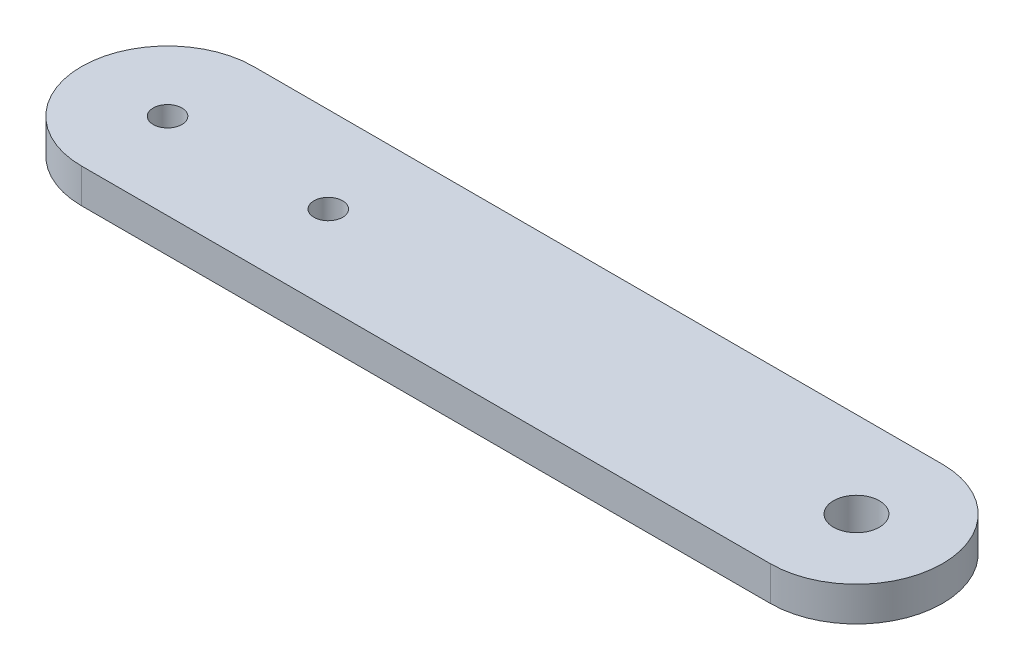
ISO-10303-21;
HEADER;
FILE_DESCRIPTION(('STEP AP214'),'2;1');
FILE_NAME('part.step','',(''),(''),'','','');
FILE_SCHEMA(('AUTOMOTIVE_DESIGN { 1 0 10303 214 1 1 1 1 }'));
ENDSEC;
DATA;
#1=APPLICATION_CONTEXT('core data for automotive mechanical design processes');
#2=APPLICATION_PROTOCOL_DEFINITION('international standard','automotive_design',2000,#1);
#3=PRODUCT_CONTEXT('',#1,'mechanical');
#4=PRODUCT('Part','Part','',(#3));
#5=PRODUCT_RELATED_PRODUCT_CATEGORY('part','',(#4));
#6=PRODUCT_DEFINITION_FORMATION('','',#4);
#7=PRODUCT_DEFINITION_CONTEXT('part definition',#1,'design');
#8=PRODUCT_DEFINITION('design','',#6,#7);
#9=PRODUCT_DEFINITION_SHAPE('','',#8);
#10=(LENGTH_UNIT() NAMED_UNIT(*) SI_UNIT(.MILLI.,.METRE.));
#11=(NAMED_UNIT(*) PLANE_ANGLE_UNIT() SI_UNIT($,.RADIAN.));
#12=(NAMED_UNIT(*) SI_UNIT($,.STERADIAN.) SOLID_ANGLE_UNIT());
#13=UNCERTAINTY_MEASURE_WITH_UNIT(LENGTH_MEASURE(1.E-05),#10,'distance_accuracy_value','');
#14=(GEOMETRIC_REPRESENTATION_CONTEXT(3) GLOBAL_UNCERTAINTY_ASSIGNED_CONTEXT((#13)) GLOBAL_UNIT_ASSIGNED_CONTEXT((#10,
#11,#12)) REPRESENTATION_CONTEXT('',''));
#15=CARTESIAN_POINT('',(0.,0.,0.));
#16=DIRECTION('',(0.,0.,1.));
#17=DIRECTION('',(1.,0.,0.));
#18=AXIS2_PLACEMENT_3D('',#15,#16,#17);
#19=CARTESIAN_POINT('',(0.,3.,0.));
#20=DIRECTION('',(0.,1.,0.));
#21=DIRECTION('',(0.,0.,1.));
#22=AXIS2_PLACEMENT_3D('',#19,#20,#21);
#23=PLANE('',#22);
#24=CARTESIAN_POINT('',(0.,3.,0.));
#25=DIRECTION('',(0.,1.,0.));
#26=DIRECTION('',(0.,0.,1.));
#27=AXIS2_PLACEMENT_3D('',#24,#25,#26);
#28=CIRCLE('',#27,1.25);
#29=CARTESIAN_POINT('',(0.,3.,1.25));
#30=VERTEX_POINT('',#29);
#31=EDGE_CURVE('E115',#30,#30,#28,.T.);
#32=ORIENTED_EDGE('',*,*,#31,.F.);
#33=EDGE_LOOP('',(#32));
#34=FACE_BOUND('',#33,.T.);
#35=CARTESIAN_POINT('',(0.,3.,0.));
#36=DIRECTION('',(0.,1.,0.));
#37=DIRECTION('',(0.,0.,1.));
#38=AXIS2_PLACEMENT_3D('',#35,#36,#37);
#39=CIRCLE('',#38,7.5);
#40=CARTESIAN_POINT('',(0.,3.,-7.5));
#41=VERTEX_POINT('',#40);
#42=CARTESIAN_POINT('',(0.,3.,7.5));
#43=VERTEX_POINT('',#42);
#44=EDGE_CURVE('E85',#41,#43,#39,.T.);
#45=ORIENTED_EDGE('',*,*,#44,.T.);
#46=DIRECTION('',(1.,0.,0.));
#47=VECTOR('',#46,1.);
#48=CARTESIAN_POINT('',(0.,3.,7.5));
#49=LINE('',#48,#47);
#50=CARTESIAN_POINT('',(60.,3.,7.5));
#51=VERTEX_POINT('',#50);
#52=EDGE_CURVE('E80',#43,#51,#49,.T.);
#53=ORIENTED_EDGE('',*,*,#52,.T.);
#54=CARTESIAN_POINT('',(60.,3.,0.));
#55=DIRECTION('',(0.,1.,0.));
#56=DIRECTION('',(0.,0.,1.));
#57=AXIS2_PLACEMENT_3D('',#54,#55,#56);
#58=CIRCLE('',#57,7.5);
#59=CARTESIAN_POINT('',(60.,3.,-7.5));
#60=VERTEX_POINT('',#59);
#61=EDGE_CURVE('E83',#51,#60,#58,.T.);
#62=ORIENTED_EDGE('',*,*,#61,.T.);
#63=DIRECTION('',(-1.,0.,0.));
#64=VECTOR('',#63,1.);
#65=CARTESIAN_POINT('',(0.,3.,-7.5));
#66=LINE('',#65,#64);
#67=EDGE_CURVE('E50',#60,#41,#66,.T.);
#68=ORIENTED_EDGE('',*,*,#67,.T.);
#69=EDGE_LOOP('',(#45,#53,#62,#68));
#70=FACE_BOUND('',#69,.T.);
#71=CARTESIAN_POINT('',(60.,3.,0.));
#72=DIRECTION('',(0.,1.,0.));
#73=DIRECTION('',(0.,0.,1.));
#74=AXIS2_PLACEMENT_3D('',#71,#72,#73);
#75=CIRCLE('',#74,2.);
#76=CARTESIAN_POINT('',(60.,3.,2.));
#77=VERTEX_POINT('',#76);
#78=EDGE_CURVE('E100',#77,#77,#75,.T.);
#79=ORIENTED_EDGE('',*,*,#78,.F.);
#80=EDGE_LOOP('',(#79));
#81=FACE_BOUND('',#80,.T.);
#82=CARTESIAN_POINT('',(14.,3.,0.));
#83=DIRECTION('',(0.,1.,0.));
#84=DIRECTION('',(0.,0.,1.));
#85=AXIS2_PLACEMENT_3D('',#82,#83,#84);
#86=CIRCLE('',#85,1.25);
#87=CARTESIAN_POINT('',(14.,3.,1.25));
#88=VERTEX_POINT('',#87);
#89=EDGE_CURVE('E121',#88,#88,#86,.T.);
#90=ORIENTED_EDGE('',*,*,#89,.F.);
#91=EDGE_LOOP('',(#90));
#92=FACE_BOUND('',#91,.T.);
#93=ADVANCED_FACE('F33',(#34,#70,#81,#92),#23,.T.);
#94=CARTESIAN_POINT('',(0.,0.,0.));
#95=DIRECTION('',(0.,1.,0.));
#96=DIRECTION('',(0.,0.,1.));
#97=AXIS2_PLACEMENT_3D('',#94,#95,#96);
#98=PLANE('',#97);
#99=CARTESIAN_POINT('',(0.,0.,0.));
#100=DIRECTION('',(0.,1.,0.));
#101=DIRECTION('',(0.,0.,1.));
#102=AXIS2_PLACEMENT_3D('',#99,#100,#101);
#103=CIRCLE('',#102,7.5);
#104=CARTESIAN_POINT('',(0.,0.,-7.5));
#105=VERTEX_POINT('',#104);
#106=CARTESIAN_POINT('',(0.,0.,7.5));
#107=VERTEX_POINT('',#106);
#108=EDGE_CURVE('E97',#105,#107,#103,.T.);
#109=ORIENTED_EDGE('',*,*,#108,.F.);
#110=DIRECTION('',(-1.,0.,0.));
#111=VECTOR('',#110,1.);
#112=CARTESIAN_POINT('',(0.,0.,-7.5));
#113=LINE('',#112,#111);
#114=CARTESIAN_POINT('',(60.,0.,-7.5));
#115=VERTEX_POINT('',#114);
#116=EDGE_CURVE('E73',#115,#105,#113,.T.);
#117=ORIENTED_EDGE('',*,*,#116,.F.);
#118=CARTESIAN_POINT('',(60.,0.,0.));
#119=DIRECTION('',(0.,1.,0.));
#120=DIRECTION('',(0.,0.,1.));
#121=AXIS2_PLACEMENT_3D('',#118,#119,#120);
#122=CIRCLE('',#121,7.5);
#123=CARTESIAN_POINT('',(60.,0.,7.5));
#124=VERTEX_POINT('',#123);
#125=EDGE_CURVE('E67',#124,#115,#122,.T.);
#126=ORIENTED_EDGE('',*,*,#125,.F.);
#127=DIRECTION('',(1.,0.,0.));
#128=VECTOR('',#127,1.);
#129=CARTESIAN_POINT('',(0.,0.,7.5));
#130=LINE('',#129,#128);
#131=EDGE_CURVE('E89',#107,#124,#130,.T.);
#132=ORIENTED_EDGE('',*,*,#131,.F.);
#133=EDGE_LOOP('',(#109,#117,#126,#132));
#134=FACE_BOUND('',#133,.T.);
#135=CARTESIAN_POINT('',(60.,0.,0.));
#136=DIRECTION('',(0.,1.,0.));
#137=DIRECTION('',(0.,0.,1.));
#138=AXIS2_PLACEMENT_3D('',#135,#136,#137);
#139=CIRCLE('',#138,2.);
#140=CARTESIAN_POINT('',(60.,0.,2.));
#141=VERTEX_POINT('',#140);
#142=EDGE_CURVE('E112',#141,#141,#139,.T.);
#143=ORIENTED_EDGE('',*,*,#142,.T.);
#144=EDGE_LOOP('',(#143));
#145=FACE_BOUND('',#144,.T.);
#146=CARTESIAN_POINT('',(0.,0.,0.));
#147=DIRECTION('',(0.,1.,0.));
#148=DIRECTION('',(0.,0.,1.));
#149=AXIS2_PLACEMENT_3D('',#146,#147,#148);
#150=CIRCLE('',#149,1.25);
#151=CARTESIAN_POINT('',(0.,0.,1.25));
#152=VERTEX_POINT('',#151);
#153=EDGE_CURVE('E118',#152,#152,#150,.T.);
#154=ORIENTED_EDGE('',*,*,#153,.T.);
#155=EDGE_LOOP('',(#154));
#156=FACE_BOUND('',#155,.T.);
#157=CARTESIAN_POINT('',(14.,0.,0.));
#158=DIRECTION('',(0.,1.,0.));
#159=DIRECTION('',(0.,0.,1.));
#160=AXIS2_PLACEMENT_3D('',#157,#158,#159);
#161=CIRCLE('',#160,1.25);
#162=CARTESIAN_POINT('',(14.,0.,1.25));
#163=VERTEX_POINT('',#162);
#164=EDGE_CURVE('E124',#163,#163,#161,.T.);
#165=ORIENTED_EDGE('',*,*,#164,.T.);
#166=EDGE_LOOP('',(#165));
#167=FACE_BOUND('',#166,.T.);
#168=ADVANCED_FACE('F108',(#134,#145,#156,#167),#98,.F.);
#169=CARTESIAN_POINT('',(0.,3.,0.));
#170=DIRECTION('',(0.,-1.,0.));
#171=DIRECTION('',(0.,0.,-1.));
#172=AXIS2_PLACEMENT_3D('',#169,#170,#171);
#173=CYLINDRICAL_SURFACE('',#172,7.5);
#174=ORIENTED_EDGE('',*,*,#108,.T.);
#175=DIRECTION('',(0.,-1.,0.));
#176=VECTOR('',#175,1.);
#177=CARTESIAN_POINT('',(0.,3.,7.5));
#178=LINE('',#177,#176);
#179=EDGE_CURVE('E11',#43,#107,#178,.T.);
#180=ORIENTED_EDGE('',*,*,#179,.F.);
#181=ORIENTED_EDGE('',*,*,#44,.F.);
#182=DIRECTION('',(0.,-1.,0.));
#183=VECTOR('',#182,1.);
#184=CARTESIAN_POINT('',(0.,3.,-7.5));
#185=LINE('',#184,#183);
#186=EDGE_CURVE('E93',#41,#105,#185,.T.);
#187=ORIENTED_EDGE('',*,*,#186,.T.);
#188=EDGE_LOOP('',(#174,#180,#181,#187));
#189=FACE_BOUND('',#188,.T.);
#190=ADVANCED_FACE('F35',(#189),#173,.T.);
#191=CARTESIAN_POINT('',(0.,3.,7.5));
#192=DIRECTION('',(0.,0.,-1.));
#193=DIRECTION('',(-1.,0.,0.));
#194=AXIS2_PLACEMENT_3D('',#191,#192,#193);
#195=PLANE('',#194);
#196=ORIENTED_EDGE('',*,*,#131,.T.);
#197=DIRECTION('',(0.,-1.,0.));
#198=VECTOR('',#197,1.);
#199=CARTESIAN_POINT('',(60.,3.,7.5));
#200=LINE('',#199,#198);
#201=EDGE_CURVE('E42',#51,#124,#200,.T.);
#202=ORIENTED_EDGE('',*,*,#201,.F.);
#203=ORIENTED_EDGE('',*,*,#52,.F.);
#204=ORIENTED_EDGE('',*,*,#179,.T.);
#205=EDGE_LOOP('',(#196,#202,#203,#204));
#206=FACE_BOUND('',#205,.T.);
#207=ADVANCED_FACE('F88',(#206),#195,.F.);
#208=CARTESIAN_POINT('',(60.,3.,0.));
#209=DIRECTION('',(0.,-1.,0.));
#210=DIRECTION('',(0.,0.,-1.));
#211=AXIS2_PLACEMENT_3D('',#208,#209,#210);
#212=CYLINDRICAL_SURFACE('',#211,7.5);
#213=ORIENTED_EDGE('',*,*,#125,.T.);
#214=DIRECTION('',(0.,-1.,0.));
#215=VECTOR('',#214,1.);
#216=CARTESIAN_POINT('',(60.,3.,-7.5));
#217=LINE('',#216,#215);
#218=EDGE_CURVE('E90',#60,#115,#217,.T.);
#219=ORIENTED_EDGE('',*,*,#218,.F.);
#220=ORIENTED_EDGE('',*,*,#61,.F.);
#221=ORIENTED_EDGE('',*,*,#201,.T.);
#222=EDGE_LOOP('',(#213,#219,#220,#221));
#223=FACE_BOUND('',#222,.T.);
#224=ADVANCED_FACE('F91',(#223),#212,.T.);
#225=CARTESIAN_POINT('',(0.,3.,-7.5));
#226=DIRECTION('',(0.,0.,1.));
#227=DIRECTION('',(1.,0.,0.));
#228=AXIS2_PLACEMENT_3D('',#225,#226,#227);
#229=PLANE('',#228);
#230=ORIENTED_EDGE('',*,*,#116,.T.);
#231=ORIENTED_EDGE('',*,*,#186,.F.);
#232=ORIENTED_EDGE('',*,*,#67,.F.);
#233=ORIENTED_EDGE('',*,*,#218,.T.);
#234=EDGE_LOOP('',(#230,#231,#232,#233));
#235=FACE_BOUND('',#234,.T.);
#236=ADVANCED_FACE('F105',(#235),#229,.F.);
#237=CARTESIAN_POINT('',(60.,3.,0.));
#238=DIRECTION('',(0.,-1.,0.));
#239=DIRECTION('',(0.,0.,-1.));
#240=AXIS2_PLACEMENT_3D('',#237,#238,#239);
#241=CYLINDRICAL_SURFACE('',#240,2.);
#242=ORIENTED_EDGE('',*,*,#78,.T.);
#243=EDGE_LOOP('',(#242));
#244=FACE_BOUND('',#243,.T.);
#245=ORIENTED_EDGE('',*,*,#142,.F.);
#246=EDGE_LOOP('',(#245));
#247=FACE_BOUND('',#246,.T.);
#248=ADVANCED_FACE('F142',(#244,#247),#241,.F.);
#249=CARTESIAN_POINT('',(0.,3.,0.));
#250=DIRECTION('',(0.,-1.,0.));
#251=DIRECTION('',(0.,0.,-1.));
#252=AXIS2_PLACEMENT_3D('',#249,#250,#251);
#253=CYLINDRICAL_SURFACE('',#252,1.25);
#254=ORIENTED_EDGE('',*,*,#31,.T.);
#255=EDGE_LOOP('',(#254));
#256=FACE_BOUND('',#255,.T.);
#257=ORIENTED_EDGE('',*,*,#153,.F.);
#258=EDGE_LOOP('',(#257));
#259=FACE_BOUND('',#258,.T.);
#260=ADVANCED_FACE('F188',(#256,#259),#253,.F.);
#261=CARTESIAN_POINT('',(14.,3.,0.));
#262=DIRECTION('',(0.,-1.,0.));
#263=DIRECTION('',(0.,0.,-1.));
#264=AXIS2_PLACEMENT_3D('',#261,#262,#263);
#265=CYLINDRICAL_SURFACE('',#264,1.25);
#266=ORIENTED_EDGE('',*,*,#89,.T.);
#267=EDGE_LOOP('',(#266));
#268=FACE_BOUND('',#267,.T.);
#269=ORIENTED_EDGE('',*,*,#164,.F.);
#270=EDGE_LOOP('',(#269));
#271=FACE_BOUND('',#270,.T.);
#272=ADVANCED_FACE('F130',(#268,#271),#265,.F.);
#273=CLOSED_SHELL('',(#93,#168,#190,#207,#224,#236,#248,#260,#272));
#274=MANIFOLD_SOLID_BREP('B2',#273);
#275=ADVANCED_BREP_SHAPE_REPRESENTATION('',(#18,#274),#14);
#276=SHAPE_DEFINITION_REPRESENTATION(#9,#275);
ENDSEC;
END-ISO-10303-21;
